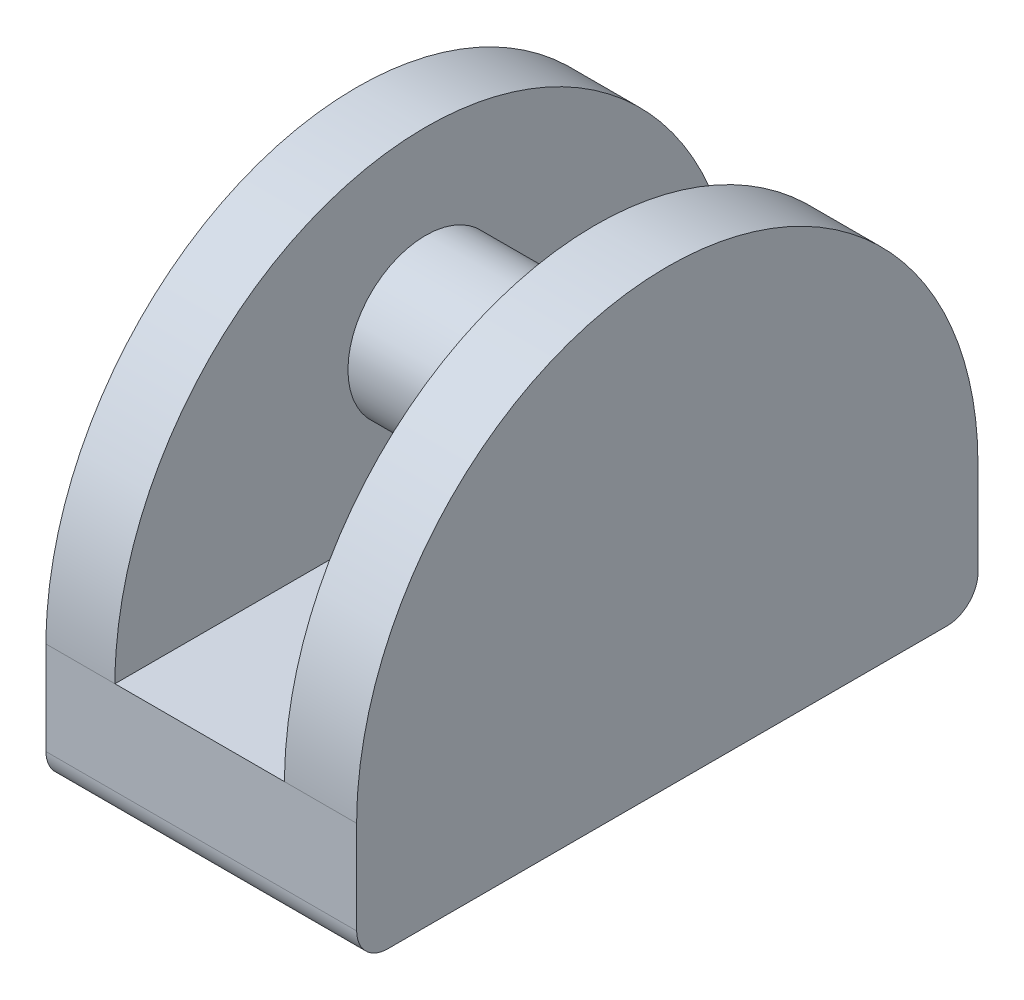
ISO-10303-21;
HEADER;
FILE_DESCRIPTION(('STEP AP214'),'2;1');
FILE_NAME('part.step','',(''),(''),'','','');
FILE_SCHEMA(('AUTOMOTIVE_DESIGN { 1 0 10303 214 1 1 1 1 }'));
ENDSEC;
DATA;
#1=APPLICATION_CONTEXT('core data for automotive mechanical design processes');
#2=APPLICATION_PROTOCOL_DEFINITION('international standard','automotive_design',2000,#1);
#3=PRODUCT_CONTEXT('',#1,'mechanical');
#4=PRODUCT('Part','Part','',(#3));
#5=PRODUCT_RELATED_PRODUCT_CATEGORY('part','',(#4));
#6=PRODUCT_DEFINITION_FORMATION('','',#4);
#7=PRODUCT_DEFINITION_CONTEXT('part definition',#1,'design');
#8=PRODUCT_DEFINITION('design','',#6,#7);
#9=PRODUCT_DEFINITION_SHAPE('','',#8);
#10=(LENGTH_UNIT() NAMED_UNIT(*) SI_UNIT(.MILLI.,.METRE.));
#11=(NAMED_UNIT(*) PLANE_ANGLE_UNIT() SI_UNIT($,.RADIAN.));
#12=(NAMED_UNIT(*) SI_UNIT($,.STERADIAN.) SOLID_ANGLE_UNIT());
#13=UNCERTAINTY_MEASURE_WITH_UNIT(LENGTH_MEASURE(1.E-05),#10,'distance_accuracy_value','');
#14=(GEOMETRIC_REPRESENTATION_CONTEXT(3) GLOBAL_UNCERTAINTY_ASSIGNED_CONTEXT((#13)) GLOBAL_UNIT_ASSIGNED_CONTEXT((#10,
#11,#12)) REPRESENTATION_CONTEXT('',''));
#15=CARTESIAN_POINT('',(0.,0.,0.));
#16=DIRECTION('',(0.,0.,1.));
#17=DIRECTION('',(1.,0.,0.));
#18=AXIS2_PLACEMENT_3D('',#15,#16,#17);
#19=CARTESIAN_POINT('',(5.,7.25420279147701E-08,-5.));
#20=DIRECTION('',(1.,0.,0.));
#21=DIRECTION('',(0.,-1.,0.));
#22=AXIS2_PLACEMENT_3D('',#19,#20,#21);
#23=ELLIPSE('',#22,5.25832088668485,5.00000000000001);
#24=DIRECTION('',(-1.,0.,0.));
#25=VECTOR('',#24,1.);
#26=SURFACE_OF_LINEAR_EXTRUSION('',#23,#25);
#27=CARTESIAN_POINT('',(1.10970357548925,7.25420279147701E-08,-5.));
#28=DIRECTION('',(1.,0.,0.));
#29=DIRECTION('',(0.,-1.,0.));
#30=AXIS2_PLACEMENT_3D('',#27,#28,#29);
#31=ELLIPSE('',#30,5.25832088668485,5.00000000000001);
#32=CARTESIAN_POINT('',(1.10970357548925,0.,-10.));
#33=VERTEX_POINT('',#32);
#34=CARTESIAN_POINT('',(1.10970357548925,0.,0.));
#35=VERTEX_POINT('',#34);
#36=EDGE_CURVE('E107',#33,#35,#31,.T.);
#37=ORIENTED_EDGE('',*,*,#36,.F.);
#38=DIRECTION('',(-1.,0.,0.));
#39=VECTOR('',#38,1.);
#40=CARTESIAN_POINT('',(5.,0.,-10.));
#41=LINE('',#40,#39);
#42=CARTESIAN_POINT('',(0.,0.,-10.));
#43=VERTEX_POINT('',#42);
#44=EDGE_CURVE('E204',#33,#43,#41,.T.);
#45=ORIENTED_EDGE('',*,*,#44,.T.);
#46=CARTESIAN_POINT('',(0.,7.25420279147701E-08,-5.));
#47=DIRECTION('',(1.,0.,0.));
#48=DIRECTION('',(0.,-1.,0.));
#49=AXIS2_PLACEMENT_3D('',#46,#47,#48);
#50=ELLIPSE('',#49,5.25832088668485,5.00000000000001);
#51=CARTESIAN_POINT('',(0.,0.,0.));
#52=VERTEX_POINT('',#51);
#53=EDGE_CURVE('E129',#43,#52,#50,.T.);
#54=ORIENTED_EDGE('',*,*,#53,.T.);
#55=DIRECTION('',(-1.,0.,0.));
#56=VECTOR('',#55,1.);
#57=CARTESIAN_POINT('',(5.,0.,0.));
#58=LINE('',#57,#56);
#59=EDGE_CURVE('E127',#35,#52,#58,.T.);
#60=ORIENTED_EDGE('',*,*,#59,.F.);
#61=EDGE_LOOP('',(#37,#45,#54,#60));
#62=FACE_BOUND('',#61,.T.);
#63=ADVANCED_FACE('F40',(#62),#26,.F.);
#64=CARTESIAN_POINT('',(3.83927637223513,7.25420279147701E-08,-5.));
#65=DIRECTION('',(1.,0.,0.));
#66=DIRECTION('',(0.,-1.,0.));
#67=AXIS2_PLACEMENT_3D('',#64,#65,#66);
#68=ELLIPSE('',#67,5.25832088668485,5.00000000000001);
#69=CARTESIAN_POINT('',(3.83927637223513,0.,0.));
#70=VERTEX_POINT('',#69);
#71=CARTESIAN_POINT('',(3.83927637223513,0.,-10.));
#72=VERTEX_POINT('',#71);
#73=EDGE_CURVE('E116',#70,#72,#68,.F.);
#74=ORIENTED_EDGE('',*,*,#73,.F.);
#75=CARTESIAN_POINT('',(5.,0.,0.));
#76=VERTEX_POINT('',#75);
#77=EDGE_CURVE('E131',#76,#70,#58,.T.);
#78=ORIENTED_EDGE('',*,*,#77,.F.);
#79=CARTESIAN_POINT('',(5.,0.,-10.));
#80=VERTEX_POINT('',#79);
#81=EDGE_CURVE('E143',#80,#76,#23,.T.);
#82=ORIENTED_EDGE('',*,*,#81,.F.);
#83=EDGE_CURVE('E202',#80,#72,#41,.T.);
#84=ORIENTED_EDGE('',*,*,#83,.T.);
#85=EDGE_LOOP('',(#74,#78,#82,#84));
#86=FACE_BOUND('',#85,.T.);
#87=ADVANCED_FACE('F153',(#86),#26,.F.);
#88=CARTESIAN_POINT('',(5.,0.,0.));
#89=DIRECTION('',(0.,0.,-1.));
#90=DIRECTION('',(0.,1.,0.));
#91=AXIS2_PLACEMENT_3D('',#88,#89,#90);
#92=PLANE('',#91);
#93=DIRECTION('',(0.,-1.,0.));
#94=VECTOR('',#93,1.);
#95=CARTESIAN_POINT('',(0.,0.,0.));
#96=LINE('',#95,#94);
#97=CARTESIAN_POINT('',(0.,-1.5,0.));
#98=VERTEX_POINT('',#97);
#99=EDGE_CURVE('E147',#52,#98,#96,.T.);
#100=ORIENTED_EDGE('',*,*,#99,.T.);
#101=DIRECTION('',(-1.,0.,0.));
#102=VECTOR('',#101,1.);
#103=CARTESIAN_POINT('',(5.,-1.5,0.));
#104=LINE('',#103,#102);
#105=CARTESIAN_POINT('',(5.,-1.5,0.));
#106=VERTEX_POINT('',#105);
#107=EDGE_CURVE('E63',#98,#106,#104,.F.);
#108=ORIENTED_EDGE('',*,*,#107,.T.);
#109=DIRECTION('',(0.,-1.,0.));
#110=VECTOR('',#109,1.);
#111=CARTESIAN_POINT('',(5.,0.,0.));
#112=LINE('',#111,#110);
#113=EDGE_CURVE('E208',#76,#106,#112,.T.);
#114=ORIENTED_EDGE('',*,*,#113,.F.);
#115=ORIENTED_EDGE('',*,*,#77,.T.);
#116=DIRECTION('',(1.,0.,0.));
#117=VECTOR('',#116,1.);
#118=CARTESIAN_POINT('',(1.10970357548925,0.,0.));
#119=LINE('',#118,#117);
#120=EDGE_CURVE('E121',#35,#70,#119,.T.);
#121=ORIENTED_EDGE('',*,*,#120,.F.);
#122=ORIENTED_EDGE('',*,*,#59,.T.);
#123=EDGE_LOOP('',(#100,#108,#114,#115,#121,#122));
#124=FACE_BOUND('',#123,.T.);
#125=ADVANCED_FACE('F135',(#124),#92,.F.);
#126=CARTESIAN_POINT('',(5.,-2.,0.));
#127=DIRECTION('',(0.,1.,0.));
#128=DIRECTION('',(0.,0.,1.));
#129=AXIS2_PLACEMENT_3D('',#126,#127,#128);
#130=PLANE('',#129);
#131=DIRECTION('',(0.,0.,-1.));
#132=VECTOR('',#131,1.);
#133=CARTESIAN_POINT('',(5.,-2.,0.));
#134=LINE('',#133,#132);
#135=CARTESIAN_POINT('',(5.,-2.,-0.5));
#136=VERTEX_POINT('',#135);
#137=CARTESIAN_POINT('',(5.,-2.,-9.5));
#138=VERTEX_POINT('',#137);
#139=EDGE_CURVE('E214',#136,#138,#134,.T.);
#140=ORIENTED_EDGE('',*,*,#139,.F.);
#141=DIRECTION('',(-1.,0.,0.));
#142=VECTOR('',#141,1.);
#143=CARTESIAN_POINT('',(5.,-2.,-0.5));
#144=LINE('',#143,#142);
#145=CARTESIAN_POINT('',(0.,-2.,-0.5));
#146=VERTEX_POINT('',#145);
#147=EDGE_CURVE('E185',#136,#146,#144,.T.);
#148=ORIENTED_EDGE('',*,*,#147,.T.);
#149=DIRECTION('',(0.,0.,-1.));
#150=VECTOR('',#149,1.);
#151=CARTESIAN_POINT('',(0.,-2.,0.));
#152=LINE('',#151,#150);
#153=CARTESIAN_POINT('',(0.,-2.,-9.5));
#154=VERTEX_POINT('',#153);
#155=EDGE_CURVE('E209',#146,#154,#152,.T.);
#156=ORIENTED_EDGE('',*,*,#155,.T.);
#157=DIRECTION('',(-1.,0.,0.));
#158=VECTOR('',#157,1.);
#159=CARTESIAN_POINT('',(5.,-2.,-9.5));
#160=LINE('',#159,#158);
#161=EDGE_CURVE('E195',#154,#138,#160,.F.);
#162=ORIENTED_EDGE('',*,*,#161,.T.);
#163=EDGE_LOOP('',(#140,#148,#156,#162));
#164=FACE_BOUND('',#163,.T.);
#165=ADVANCED_FACE('F165',(#164),#130,.F.);
#166=CARTESIAN_POINT('',(5.,0.,-10.));
#167=DIRECTION('',(0.,0.,1.));
#168=DIRECTION('',(1.,0.,0.));
#169=AXIS2_PLACEMENT_3D('',#166,#167,#168);
#170=PLANE('',#169);
#171=DIRECTION('',(0.,1.,0.));
#172=VECTOR('',#171,1.);
#173=CARTESIAN_POINT('',(5.,0.,-10.));
#174=LINE('',#173,#172);
#175=CARTESIAN_POINT('',(5.,-1.5,-10.));
#176=VERTEX_POINT('',#175);
#177=EDGE_CURVE('E132',#176,#80,#174,.T.);
#178=ORIENTED_EDGE('',*,*,#177,.F.);
#179=DIRECTION('',(-1.,0.,0.));
#180=VECTOR('',#179,1.);
#181=CARTESIAN_POINT('',(5.,-1.5,-10.));
#182=LINE('',#181,#180);
#183=CARTESIAN_POINT('',(0.,-1.5,-10.));
#184=VERTEX_POINT('',#183);
#185=EDGE_CURVE('E11',#176,#184,#182,.T.);
#186=ORIENTED_EDGE('',*,*,#185,.T.);
#187=DIRECTION('',(0.,1.,0.));
#188=VECTOR('',#187,1.);
#189=CARTESIAN_POINT('',(0.,0.,-10.));
#190=LINE('',#189,#188);
#191=EDGE_CURVE('E206',#184,#43,#190,.T.);
#192=ORIENTED_EDGE('',*,*,#191,.T.);
#193=ORIENTED_EDGE('',*,*,#44,.F.);
#194=DIRECTION('',(-1.,0.,0.));
#195=VECTOR('',#194,1.);
#196=CARTESIAN_POINT('',(1.10970357548925,0.,-10.));
#197=LINE('',#196,#195);
#198=EDGE_CURVE('E124',#72,#33,#197,.T.);
#199=ORIENTED_EDGE('',*,*,#198,.F.);
#200=ORIENTED_EDGE('',*,*,#83,.F.);
#201=EDGE_LOOP('',(#178,#186,#192,#193,#199,#200));
#202=FACE_BOUND('',#201,.T.);
#203=ADVANCED_FACE('F159',(#202),#170,.F.);
#204=CARTESIAN_POINT('',(5.,0.,0.));
#205=DIRECTION('',(1.,0.,0.));
#206=DIRECTION('',(0.,0.,-1.));
#207=AXIS2_PLACEMENT_3D('',#204,#205,#206);
#208=PLANE('',#207);
#209=ORIENTED_EDGE('',*,*,#113,.T.);
#210=CARTESIAN_POINT('',(5.,-1.5,-0.5));
#211=DIRECTION('',(1.,0.,0.));
#212=DIRECTION('',(0.,0.,-1.));
#213=AXIS2_PLACEMENT_3D('',#210,#211,#212);
#214=CIRCLE('',#213,0.5);
#215=EDGE_CURVE('E48',#106,#136,#214,.T.);
#216=ORIENTED_EDGE('',*,*,#215,.T.);
#217=ORIENTED_EDGE('',*,*,#139,.T.);
#218=CARTESIAN_POINT('',(5.,-1.5,-9.5));
#219=DIRECTION('',(1.,0.,0.));
#220=DIRECTION('',(0.,0.,-1.));
#221=AXIS2_PLACEMENT_3D('',#218,#219,#220);
#222=CIRCLE('',#221,0.5);
#223=EDGE_CURVE('E55',#138,#176,#222,.T.);
#224=ORIENTED_EDGE('',*,*,#223,.T.);
#225=ORIENTED_EDGE('',*,*,#177,.T.);
#226=ORIENTED_EDGE('',*,*,#81,.T.);
#227=EDGE_LOOP('',(#209,#216,#217,#224,#225,#226));
#228=FACE_BOUND('',#227,.T.);
#229=ADVANCED_FACE('F155',(#228),#208,.T.);
#230=CARTESIAN_POINT('',(0.,0.,0.));
#231=DIRECTION('',(1.,0.,0.));
#232=DIRECTION('',(0.,0.,-1.));
#233=AXIS2_PLACEMENT_3D('',#230,#231,#232);
#234=PLANE('',#233);
#235=ORIENTED_EDGE('',*,*,#155,.F.);
#236=CARTESIAN_POINT('',(0.,-1.5,-0.5));
#237=DIRECTION('',(1.,0.,0.));
#238=DIRECTION('',(0.,0.,-1.));
#239=AXIS2_PLACEMENT_3D('',#236,#237,#238);
#240=CIRCLE('',#239,0.5);
#241=EDGE_CURVE('E190',#146,#98,#240,.F.);
#242=ORIENTED_EDGE('',*,*,#241,.T.);
#243=ORIENTED_EDGE('',*,*,#99,.F.);
#244=ORIENTED_EDGE('',*,*,#53,.F.);
#245=ORIENTED_EDGE('',*,*,#191,.F.);
#246=CARTESIAN_POINT('',(0.,-1.5,-9.5));
#247=DIRECTION('',(1.,0.,0.));
#248=DIRECTION('',(0.,0.,-1.));
#249=AXIS2_PLACEMENT_3D('',#246,#247,#248);
#250=CIRCLE('',#249,0.5);
#251=EDGE_CURVE('E192',#184,#154,#250,.F.);
#252=ORIENTED_EDGE('',*,*,#251,.T.);
#253=EDGE_LOOP('',(#235,#242,#243,#244,#245,#252));
#254=FACE_BOUND('',#253,.T.);
#255=ADVANCED_FACE('F158',(#254),#234,.F.);
#256=CARTESIAN_POINT('',(1.10970357548925,6.,-10.));
#257=DIRECTION('',(1.,0.,0.));
#258=DIRECTION('',(0.,0.,-1.));
#259=AXIS2_PLACEMENT_3D('',#256,#257,#258);
#260=PLANE('',#259);
#261=CARTESIAN_POINT('',(1.10970357548925,2.5,-5.));
#262=DIRECTION('',(1.,0.,0.));
#263=DIRECTION('',(0.,0.,-1.));
#264=AXIS2_PLACEMENT_3D('',#261,#262,#263);
#265=CIRCLE('',#264,1.25);
#266=CARTESIAN_POINT('',(1.10970357548925,2.5,-6.25));
#267=VERTEX_POINT('',#266);
#268=EDGE_CURVE('E197',#267,#267,#265,.T.);
#269=ORIENTED_EDGE('',*,*,#268,.F.);
#270=EDGE_LOOP('',(#269));
#271=FACE_BOUND('',#270,.T.);
#272=ORIENTED_EDGE('',*,*,#36,.T.);
#273=DIRECTION('',(0.,0.,1.));
#274=VECTOR('',#273,1.);
#275=CARTESIAN_POINT('',(1.10970357548925,0.,-10.));
#276=LINE('',#275,#274);
#277=EDGE_CURVE('E110',#33,#35,#276,.T.);
#278=ORIENTED_EDGE('',*,*,#277,.F.);
#279=EDGE_LOOP('',(#272,#278));
#280=FACE_BOUND('',#279,.T.);
#281=ADVANCED_FACE('F109',(#271,#280),#260,.T.);
#282=CARTESIAN_POINT('',(3.83927637223513,6.,-10.));
#283=DIRECTION('',(-1.,0.,0.));
#284=DIRECTION('',(0.,0.,1.));
#285=AXIS2_PLACEMENT_3D('',#282,#283,#284);
#286=PLANE('',#285);
#287=CARTESIAN_POINT('',(3.83927637223513,2.5,-5.));
#288=DIRECTION('',(-1.,0.,0.));
#289=DIRECTION('',(0.,0.,1.));
#290=AXIS2_PLACEMENT_3D('',#287,#288,#289);
#291=CIRCLE('',#290,1.25);
#292=CARTESIAN_POINT('',(3.83927637223513,2.5,-3.75));
#293=VERTEX_POINT('',#292);
#294=EDGE_CURVE('E115',#293,#293,#291,.T.);
#295=ORIENTED_EDGE('',*,*,#294,.F.);
#296=EDGE_LOOP('',(#295));
#297=FACE_BOUND('',#296,.T.);
#298=ORIENTED_EDGE('',*,*,#73,.T.);
#299=DIRECTION('',(0.,0.,-1.));
#300=VECTOR('',#299,1.);
#301=CARTESIAN_POINT('',(3.83927637223513,0.,-10.));
#302=LINE('',#301,#300);
#303=EDGE_CURVE('E137',#70,#72,#302,.T.);
#304=ORIENTED_EDGE('',*,*,#303,.F.);
#305=EDGE_LOOP('',(#298,#304));
#306=FACE_BOUND('',#305,.T.);
#307=ADVANCED_FACE('F220',(#297,#306),#286,.T.);
#308=CARTESIAN_POINT('',(0.,0.,0.));
#309=DIRECTION('',(0.,1.,0.));
#310=DIRECTION('',(0.,0.,1.));
#311=AXIS2_PLACEMENT_3D('',#308,#309,#310);
#312=PLANE('',#311);
#313=ORIENTED_EDGE('',*,*,#277,.T.);
#314=ORIENTED_EDGE('',*,*,#120,.T.);
#315=ORIENTED_EDGE('',*,*,#303,.T.);
#316=ORIENTED_EDGE('',*,*,#198,.T.);
#317=EDGE_LOOP('',(#313,#314,#315,#316));
#318=FACE_BOUND('',#317,.T.);
#319=ADVANCED_FACE('F119',(#318),#312,.T.);
#320=CARTESIAN_POINT('',(5.,2.5,-5.));
#321=DIRECTION('',(-1.,0.,0.));
#322=DIRECTION('',(0.,0.,1.));
#323=AXIS2_PLACEMENT_3D('',#320,#321,#322);
#324=CYLINDRICAL_SURFACE('',#323,1.25);
#325=ORIENTED_EDGE('',*,*,#268,.T.);
#326=EDGE_LOOP('',(#325));
#327=FACE_BOUND('',#326,.T.);
#328=ORIENTED_EDGE('',*,*,#294,.T.);
#329=EDGE_LOOP('',(#328));
#330=FACE_BOUND('',#329,.T.);
#331=ADVANCED_FACE('F173',(#327,#330),#324,.T.);
#332=CARTESIAN_POINT('',(5.,-1.5,-0.5));
#333=DIRECTION('',(-1.,0.,0.));
#334=DIRECTION('',(0.,0.,1.));
#335=AXIS2_PLACEMENT_3D('',#332,#333,#334);
#336=CYLINDRICAL_SURFACE('',#335,0.5);
#337=ORIENTED_EDGE('',*,*,#215,.F.);
#338=ORIENTED_EDGE('',*,*,#107,.F.);
#339=ORIENTED_EDGE('',*,*,#241,.F.);
#340=ORIENTED_EDGE('',*,*,#147,.F.);
#341=EDGE_LOOP('',(#337,#338,#339,#340));
#342=FACE_BOUND('',#341,.T.);
#343=ADVANCED_FACE('F171',(#342),#336,.T.);
#344=CARTESIAN_POINT('',(5.,-1.5,-9.5));
#345=DIRECTION('',(-1.,0.,0.));
#346=DIRECTION('',(0.,0.,1.));
#347=AXIS2_PLACEMENT_3D('',#344,#345,#346);
#348=CYLINDRICAL_SURFACE('',#347,0.5);
#349=ORIENTED_EDGE('',*,*,#223,.F.);
#350=ORIENTED_EDGE('',*,*,#161,.F.);
#351=ORIENTED_EDGE('',*,*,#251,.F.);
#352=ORIENTED_EDGE('',*,*,#185,.F.);
#353=EDGE_LOOP('',(#349,#350,#351,#352));
#354=FACE_BOUND('',#353,.T.);
#355=ADVANCED_FACE('F42',(#354),#348,.T.);
#356=CLOSED_SHELL('',(#63,#87,#125,#165,#203,#229,#255,#281,#307,#319,#331,#343,#355));
#357=MANIFOLD_SOLID_BREP('B2',#356);
#358=ADVANCED_BREP_SHAPE_REPRESENTATION('',(#18,#357),#14);
#359=SHAPE_DEFINITION_REPRESENTATION(#9,#358);
ENDSEC;
END-ISO-10303-21;
